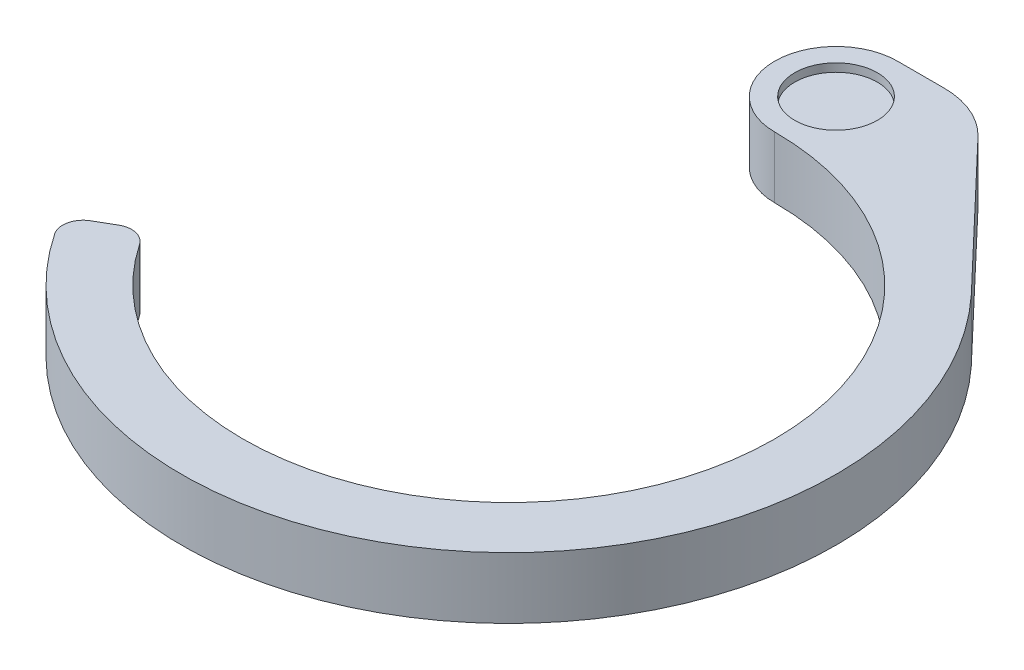
ISO-10303-21;
HEADER;
FILE_DESCRIPTION(('STEP AP214'),'2;1');
FILE_NAME('part.step','',(''),(''),'','','');
FILE_SCHEMA(('AUTOMOTIVE_DESIGN { 1 0 10303 214 1 1 1 1 }'));
ENDSEC;
DATA;
#1=APPLICATION_CONTEXT('core data for automotive mechanical design processes');
#2=APPLICATION_PROTOCOL_DEFINITION('international standard','automotive_design',2000,#1);
#3=PRODUCT_CONTEXT('',#1,'mechanical');
#4=PRODUCT('Part','Part','',(#3));
#5=PRODUCT_RELATED_PRODUCT_CATEGORY('part','',(#4));
#6=PRODUCT_DEFINITION_FORMATION('','',#4);
#7=PRODUCT_DEFINITION_CONTEXT('part definition',#1,'design');
#8=PRODUCT_DEFINITION('design','',#6,#7);
#9=PRODUCT_DEFINITION_SHAPE('','',#8);
#10=(LENGTH_UNIT() NAMED_UNIT(*) SI_UNIT(.MILLI.,.METRE.));
#11=(NAMED_UNIT(*) PLANE_ANGLE_UNIT() SI_UNIT($,.RADIAN.));
#12=(NAMED_UNIT(*) SI_UNIT($,.STERADIAN.) SOLID_ANGLE_UNIT());
#13=UNCERTAINTY_MEASURE_WITH_UNIT(LENGTH_MEASURE(1.E-05),#10,'distance_accuracy_value','');
#14=(GEOMETRIC_REPRESENTATION_CONTEXT(3) GLOBAL_UNCERTAINTY_ASSIGNED_CONTEXT((#13)) GLOBAL_UNIT_ASSIGNED_CONTEXT((#10,
#11,#12)) REPRESENTATION_CONTEXT('',''));
#15=CARTESIAN_POINT('',(0.,0.,0.));
#16=DIRECTION('',(0.,0.,1.));
#17=DIRECTION('',(1.,0.,0.));
#18=AXIS2_PLACEMENT_3D('',#15,#16,#17);
#19=CARTESIAN_POINT('',(-62.3074069840787,15.,41.7467008866615));
#20=DIRECTION('',(0.,-1.,0.));
#21=DIRECTION('',(0.,0.,-1.));
#22=AXIS2_PLACEMENT_3D('',#19,#20,#21);
#23=CYLINDRICAL_SURFACE('',#22,5.00000000000001);
#24=CARTESIAN_POINT('',(-62.3074069840787,0.,41.7467008866615));
#25=DIRECTION('',(0.,1.,0.));
#26=DIRECTION('',(0.,0.,1.));
#27=AXIS2_PLACEMENT_3D('',#24,#25,#26);
#28=CIRCLE('',#27,5.00000000000001);
#29=CARTESIAN_POINT('',(-66.4612341163506,0.,44.5298142791056));
#30=VERTEX_POINT('',#29);
#31=CARTESIAN_POINT('',(-64.8074069840787,0.,37.4165738677393));
#32=VERTEX_POINT('',#31);
#33=EDGE_CURVE('E134',#30,#32,#28,.F.);
#34=ORIENTED_EDGE('',*,*,#33,.F.);
#35=DIRECTION('',(0.,-1.,0.));
#36=VECTOR('',#35,1.);
#37=CARTESIAN_POINT('',(-66.4612341163506,15.,44.5298142791056));
#38=LINE('',#37,#36);
#39=CARTESIAN_POINT('',(-66.4612341163506,15.,44.5298142791056));
#40=VERTEX_POINT('',#39);
#41=EDGE_CURVE('E11',#40,#30,#38,.T.);
#42=ORIENTED_EDGE('',*,*,#41,.F.);
#43=CARTESIAN_POINT('',(-62.3074069840787,15.,41.7467008866615));
#44=DIRECTION('',(0.,1.,0.));
#45=DIRECTION('',(0.,0.,1.));
#46=AXIS2_PLACEMENT_3D('',#43,#44,#45);
#47=CIRCLE('',#46,5.00000000000001);
#48=CARTESIAN_POINT('',(-64.8074069840787,15.,37.4165738677393));
#49=VERTEX_POINT('',#48);
#50=EDGE_CURVE('E157',#40,#49,#47,.F.);
#51=ORIENTED_EDGE('',*,*,#50,.T.);
#52=DIRECTION('',(0.,-1.,0.));
#53=VECTOR('',#52,1.);
#54=CARTESIAN_POINT('',(-64.8074069840787,15.,37.4165738677393));
#55=LINE('',#54,#53);
#56=EDGE_CURVE('E86',#49,#32,#55,.T.);
#57=ORIENTED_EDGE('',*,*,#56,.T.);
#58=EDGE_LOOP('',(#34,#42,#51,#57));
#59=FACE_BOUND('',#58,.T.);
#60=ADVANCED_FACE('F33',(#59),#23,.T.);
#61=CARTESIAN_POINT('',(0.,15.,0.));
#62=DIRECTION('',(0.,-1.,0.));
#63=DIRECTION('',(0.,0.,-1.));
#64=AXIS2_PLACEMENT_3D('',#61,#62,#63);
#65=CYLINDRICAL_SURFACE('',#64,80.);
#66=CARTESIAN_POINT('',(0.,0.,0.));
#67=DIRECTION('',(0.,1.,0.));
#68=DIRECTION('',(0.,0.,1.));
#69=AXIS2_PLACEMENT_3D('',#66,#67,#68);
#70=CIRCLE('',#69,80.);
#71=CARTESIAN_POINT('',(58.5757297296054,0.,-54.4874654085159));
#72=VERTEX_POINT('',#71);
#73=EDGE_CURVE('E137',#30,#72,#70,.T.);
#74=ORIENTED_EDGE('',*,*,#73,.T.);
#75=DIRECTION('',(0.,-1.,0.));
#76=VECTOR('',#75,1.);
#77=CARTESIAN_POINT('',(58.5757297296054,15.,-54.4874654085159));
#78=LINE('',#77,#76);
#79=CARTESIAN_POINT('',(58.5757297296054,15.,-54.4874654085159));
#80=VERTEX_POINT('',#79);
#81=EDGE_CURVE('E41',#80,#72,#78,.T.);
#82=ORIENTED_EDGE('',*,*,#81,.F.);
#83=CARTESIAN_POINT('',(0.,15.,0.));
#84=DIRECTION('',(0.,1.,0.));
#85=DIRECTION('',(0.,0.,1.));
#86=AXIS2_PLACEMENT_3D('',#83,#84,#85);
#87=CIRCLE('',#86,80.);
#88=EDGE_CURVE('E187',#40,#80,#87,.T.);
#89=ORIENTED_EDGE('',*,*,#88,.F.);
#90=ORIENTED_EDGE('',*,*,#41,.T.);
#91=EDGE_LOOP('',(#74,#82,#89,#90));
#92=FACE_BOUND('',#91,.T.);
#93=ADVANCED_FACE('F175',(#92),#65,.T.);
#94=CARTESIAN_POINT('',(57.9325504327501,15.,-55.1629373618664));
#95=DIRECTION('',(0.724206102182212,0.,-0.689583585623996));
#96=DIRECTION('',(-0.689583585623996,0.,-0.724206102182212));
#97=AXIS2_PLACEMENT_3D('',#94,#95,#96);
#98=PLANE('',#97);
#99=DIRECTION('',(0.689583585623996,0.,0.724206102182212));
#100=VECTOR('',#99,1.);
#101=CARTESIAN_POINT('',(57.9325504327501,0.,-55.1629373618664));
#102=LINE('',#101,#100);
#103=CARTESIAN_POINT('',(25.911523347206,0.,-88.7916717124799));
#104=VERTEX_POINT('',#103);
#105=EDGE_CURVE('E141',#104,#72,#102,.T.);
#106=ORIENTED_EDGE('',*,*,#105,.F.);
#107=DIRECTION('',(0.,-1.,0.));
#108=VECTOR('',#107,1.);
#109=CARTESIAN_POINT('',(25.911523347206,15.,-88.7916717124799));
#110=LINE('',#109,#108);
#111=CARTESIAN_POINT('',(25.911523347206,15.,-88.7916717124799));
#112=VERTEX_POINT('',#111);
#113=EDGE_CURVE('E165',#112,#104,#110,.T.);
#114=ORIENTED_EDGE('',*,*,#113,.F.);
#115=DIRECTION('',(0.689583585623996,0.,0.724206102182212));
#116=VECTOR('',#115,1.);
#117=CARTESIAN_POINT('',(57.9325504327501,15.,-55.1629373618664));
#118=LINE('',#117,#116);
#119=EDGE_CURVE('E172',#112,#80,#118,.T.);
#120=ORIENTED_EDGE('',*,*,#119,.T.);
#121=ORIENTED_EDGE('',*,*,#81,.T.);
#122=EDGE_LOOP('',(#106,#114,#120,#121));
#123=FACE_BOUND('',#122,.T.);
#124=ADVANCED_FACE('F170',(#123),#98,.T.);
#125=CARTESIAN_POINT('',(11.4274013035615,15.,-75.));
#126=DIRECTION('',(0.,-1.,0.));
#127=DIRECTION('',(0.,0.,-1.));
#128=AXIS2_PLACEMENT_3D('',#125,#126,#127);
#129=CYLINDRICAL_SURFACE('',#128,20.0000000000001);
#130=CARTESIAN_POINT('',(11.4274013035615,0.,-75.));
#131=DIRECTION('',(0.,1.,0.));
#132=DIRECTION('',(0.,0.,1.));
#133=AXIS2_PLACEMENT_3D('',#130,#131,#132);
#134=CIRCLE('',#133,20.0000000000001);
#135=CARTESIAN_POINT('',(11.4274013035618,0.,-95.));
#136=VERTEX_POINT('',#135);
#137=EDGE_CURVE('E144',#136,#104,#134,.F.);
#138=ORIENTED_EDGE('',*,*,#137,.F.);
#139=DIRECTION('',(0.,-1.,0.));
#140=VECTOR('',#139,1.);
#141=CARTESIAN_POINT('',(11.4274013035618,15.,-95.));
#142=LINE('',#141,#140);
#143=CARTESIAN_POINT('',(11.4274013035618,15.,-95.));
#144=VERTEX_POINT('',#143);
#145=EDGE_CURVE('E163',#144,#136,#142,.T.);
#146=ORIENTED_EDGE('',*,*,#145,.F.);
#147=CARTESIAN_POINT('',(11.4274013035615,15.,-75.));
#148=DIRECTION('',(0.,1.,0.));
#149=DIRECTION('',(0.,0.,1.));
#150=AXIS2_PLACEMENT_3D('',#147,#148,#149);
#151=CIRCLE('',#150,20.0000000000001);
#152=EDGE_CURVE('E185',#144,#112,#151,.F.);
#153=ORIENTED_EDGE('',*,*,#152,.T.);
#154=ORIENTED_EDGE('',*,*,#113,.T.);
#155=EDGE_LOOP('',(#138,#146,#153,#154));
#156=FACE_BOUND('',#155,.T.);
#157=ADVANCED_FACE('F182',(#156),#129,.T.);
#158=CARTESIAN_POINT('',(-1.15370923512719E-13,15.,-95.));
#159=DIRECTION('',(0.,0.,-1.));
#160=DIRECTION('',(-1.,0.,0.));
#161=AXIS2_PLACEMENT_3D('',#158,#159,#160);
#162=PLANE('',#161);
#163=DIRECTION('',(1.,0.,0.));
#164=VECTOR('',#163,1.);
#165=CARTESIAN_POINT('',(-1.15370923512719E-13,0.,-95.));
#166=LINE('',#165,#164);
#167=CARTESIAN_POINT('',(0.,0.,-95.));
#168=VERTEX_POINT('',#167);
#169=EDGE_CURVE('E147',#168,#136,#166,.T.);
#170=ORIENTED_EDGE('',*,*,#169,.F.);
#171=DIRECTION('',(0.,-1.,0.));
#172=VECTOR('',#171,1.);
#173=CARTESIAN_POINT('',(0.,15.,-95.));
#174=LINE('',#173,#172);
#175=CARTESIAN_POINT('',(0.,15.,-95.));
#176=VERTEX_POINT('',#175);
#177=EDGE_CURVE('E161',#176,#168,#174,.T.);
#178=ORIENTED_EDGE('',*,*,#177,.F.);
#179=DIRECTION('',(1.,0.,0.));
#180=VECTOR('',#179,1.);
#181=CARTESIAN_POINT('',(-1.15370923512719E-13,15.,-95.));
#182=LINE('',#181,#180);
#183=EDGE_CURVE('E129',#176,#144,#182,.T.);
#184=ORIENTED_EDGE('',*,*,#183,.T.);
#185=ORIENTED_EDGE('',*,*,#145,.T.);
#186=EDGE_LOOP('',(#170,#178,#184,#185));
#187=FACE_BOUND('',#186,.T.);
#188=ADVANCED_FACE('F193',(#187),#162,.T.);
#189=CARTESIAN_POINT('',(0.,15.,-80.));
#190=DIRECTION('',(0.,-1.,0.));
#191=DIRECTION('',(0.,0.,-1.));
#192=AXIS2_PLACEMENT_3D('',#189,#190,#191);
#193=CYLINDRICAL_SURFACE('',#192,15.);
#194=CARTESIAN_POINT('',(0.,0.,-80.));
#195=DIRECTION('',(0.,1.,0.));
#196=DIRECTION('',(0.,0.,1.));
#197=AXIS2_PLACEMENT_3D('',#194,#195,#196);
#198=CIRCLE('',#197,15.);
#199=CARTESIAN_POINT('',(0.,0.,-65.));
#200=VERTEX_POINT('',#199);
#201=EDGE_CURVE('E150',#168,#200,#198,.T.);
#202=ORIENTED_EDGE('',*,*,#201,.T.);
#203=DIRECTION('',(0.,-1.,0.));
#204=VECTOR('',#203,1.);
#205=CARTESIAN_POINT('',(0.,15.,-65.));
#206=LINE('',#205,#204);
#207=CARTESIAN_POINT('',(0.,15.,-65.));
#208=VERTEX_POINT('',#207);
#209=EDGE_CURVE('E117',#208,#200,#206,.T.);
#210=ORIENTED_EDGE('',*,*,#209,.F.);
#211=CARTESIAN_POINT('',(0.,15.,-80.));
#212=DIRECTION('',(0.,1.,0.));
#213=DIRECTION('',(0.,0.,1.));
#214=AXIS2_PLACEMENT_3D('',#211,#212,#213);
#215=CIRCLE('',#214,15.);
#216=EDGE_CURVE('E126',#176,#208,#215,.T.);
#217=ORIENTED_EDGE('',*,*,#216,.F.);
#218=ORIENTED_EDGE('',*,*,#177,.T.);
#219=EDGE_LOOP('',(#202,#210,#217,#218));
#220=FACE_BOUND('',#219,.T.);
#221=ADVANCED_FACE('F195',(#220),#193,.T.);
#222=CARTESIAN_POINT('',(0.,15.,0.));
#223=DIRECTION('',(0.,-1.,0.));
#224=DIRECTION('',(0.,0.,-1.));
#225=AXIS2_PLACEMENT_3D('',#222,#223,#224);
#226=CYLINDRICAL_SURFACE('',#225,65.);
#227=CARTESIAN_POINT('',(0.,0.,0.));
#228=DIRECTION('',(0.,1.,0.));
#229=DIRECTION('',(0.,0.,1.));
#230=AXIS2_PLACEMENT_3D('',#227,#228,#229);
#231=CIRCLE('',#230,65.);
#232=CARTESIAN_POINT('',(-53.8264378899364,0.,36.4378180477484));
#233=VERTEX_POINT('',#232);
#234=EDGE_CURVE('E116',#233,#200,#231,.T.);
#235=ORIENTED_EDGE('',*,*,#234,.F.);
#236=DIRECTION('',(0.,-1.,0.));
#237=VECTOR('',#236,1.);
#238=CARTESIAN_POINT('',(-53.8264378899364,15.,36.4378180477484));
#239=LINE('',#238,#237);
#240=CARTESIAN_POINT('',(-53.8264378899364,15.,36.4378180477484));
#241=VERTEX_POINT('',#240);
#242=EDGE_CURVE('E110',#241,#233,#239,.T.);
#243=ORIENTED_EDGE('',*,*,#242,.F.);
#244=CARTESIAN_POINT('',(0.,15.,0.));
#245=DIRECTION('',(0.,1.,0.));
#246=DIRECTION('',(0.,0.,1.));
#247=AXIS2_PLACEMENT_3D('',#244,#245,#246);
#248=CIRCLE('',#247,65.);
#249=EDGE_CURVE('E114',#241,#208,#248,.T.);
#250=ORIENTED_EDGE('',*,*,#249,.T.);
#251=ORIENTED_EDGE('',*,*,#209,.T.);
#252=EDGE_LOOP('',(#235,#243,#250,#251));
#253=FACE_BOUND('',#252,.T.);
#254=ADVANCED_FACE('F112',(#253),#226,.F.);
#255=CARTESIAN_POINT('',(-57.9669331122392,15.,39.2407271283444));
#256=DIRECTION('',(0.,-1.,0.));
#257=DIRECTION('',(0.,0.,-1.));
#258=AXIS2_PLACEMENT_3D('',#255,#256,#257);
#259=CYLINDRICAL_SURFACE('',#258,5.);
#260=CARTESIAN_POINT('',(-57.9669331122392,0.,39.2407271283444));
#261=DIRECTION('',(0.,1.,0.));
#262=DIRECTION('',(0.,0.,1.));
#263=AXIS2_PLACEMENT_3D('',#260,#261,#262);
#264=CIRCLE('',#263,5.);
#265=CARTESIAN_POINT('',(-60.4669331122392,0.,34.9106001094222));
#266=VERTEX_POINT('',#265);
#267=EDGE_CURVE('E79',#233,#266,#264,.T.);
#268=ORIENTED_EDGE('',*,*,#267,.T.);
#269=DIRECTION('',(0.,-1.,0.));
#270=VECTOR('',#269,1.);
#271=CARTESIAN_POINT('',(-60.4669331122392,15.,34.9106001094222));
#272=LINE('',#271,#270);
#273=CARTESIAN_POINT('',(-60.4669331122392,15.,34.9106001094222));
#274=VERTEX_POINT('',#273);
#275=EDGE_CURVE('E118',#274,#266,#272,.T.);
#276=ORIENTED_EDGE('',*,*,#275,.F.);
#277=CARTESIAN_POINT('',(-57.9669331122392,15.,39.2407271283444));
#278=DIRECTION('',(0.,1.,0.));
#279=DIRECTION('',(0.,0.,1.));
#280=AXIS2_PLACEMENT_3D('',#277,#278,#279);
#281=CIRCLE('',#280,5.);
#282=EDGE_CURVE('E120',#241,#274,#281,.T.);
#283=ORIENTED_EDGE('',*,*,#282,.F.);
#284=ORIENTED_EDGE('',*,*,#242,.T.);
#285=EDGE_LOOP('',(#268,#276,#283,#284));
#286=FACE_BOUND('',#285,.T.);
#287=ADVANCED_FACE('F121',(#286),#259,.T.);
#288=CARTESIAN_POINT('',(0.,15.,0.));
#289=DIRECTION('',(0.499999999999997,0.,0.86602540378444));
#290=DIRECTION('',(0.86602540378444,0.,-0.499999999999997));
#291=AXIS2_PLACEMENT_3D('',#288,#289,#290);
#292=PLANE('',#291);
#293=DIRECTION('',(-0.86602540378444,0.,0.499999999999997));
#294=VECTOR('',#293,1.);
#295=CARTESIAN_POINT('',(0.,0.,0.));
#296=LINE('',#295,#294);
#297=EDGE_CURVE('E155',#266,#32,#296,.T.);
#298=ORIENTED_EDGE('',*,*,#297,.T.);
#299=ORIENTED_EDGE('',*,*,#56,.F.);
#300=DIRECTION('',(-0.86602540378444,0.,0.499999999999997));
#301=VECTOR('',#300,1.);
#302=CARTESIAN_POINT('',(0.,15.,0.));
#303=LINE('',#302,#301);
#304=EDGE_CURVE('E49',#274,#49,#303,.T.);
#305=ORIENTED_EDGE('',*,*,#304,.F.);
#306=ORIENTED_EDGE('',*,*,#275,.T.);
#307=EDGE_LOOP('',(#298,#299,#305,#306));
#308=FACE_BOUND('',#307,.T.);
#309=ADVANCED_FACE('F198',(#308),#292,.F.);
#310=CARTESIAN_POINT('',(0.,15.,0.));
#311=DIRECTION('',(0.,1.,0.));
#312=DIRECTION('',(0.,0.,1.));
#313=AXIS2_PLACEMENT_3D('',#310,#311,#312);
#314=PLANE('',#313);
#315=CARTESIAN_POINT('',(0.,15.,-80.));
#316=DIRECTION('',(0.,1.,0.));
#317=DIRECTION('',(0.,0.,1.));
#318=AXIS2_PLACEMENT_3D('',#315,#316,#317);
#319=CIRCLE('',#318,10.1);
#320=CARTESIAN_POINT('',(0.,15.,-69.9));
#321=VERTEX_POINT('',#320);
#322=EDGE_CURVE('E200',#321,#321,#319,.T.);
#323=ORIENTED_EDGE('',*,*,#322,.F.);
#324=EDGE_LOOP('',(#323));
#325=FACE_BOUND('',#324,.T.);
#326=ORIENTED_EDGE('',*,*,#50,.F.);
#327=ORIENTED_EDGE('',*,*,#88,.T.);
#328=ORIENTED_EDGE('',*,*,#119,.F.);
#329=ORIENTED_EDGE('',*,*,#152,.F.);
#330=ORIENTED_EDGE('',*,*,#183,.F.);
#331=ORIENTED_EDGE('',*,*,#216,.T.);
#332=ORIENTED_EDGE('',*,*,#249,.F.);
#333=ORIENTED_EDGE('',*,*,#282,.T.);
#334=ORIENTED_EDGE('',*,*,#304,.T.);
#335=EDGE_LOOP('',(#326,#327,#328,#329,#330,#331,#332,#333,#334));
#336=FACE_BOUND('',#335,.T.);
#337=ADVANCED_FACE('F123',(#325,#336),#314,.T.);
#338=CARTESIAN_POINT('',(0.,0.,0.));
#339=DIRECTION('',(0.,1.,0.));
#340=DIRECTION('',(0.,0.,1.));
#341=AXIS2_PLACEMENT_3D('',#338,#339,#340);
#342=PLANE('',#341);
#343=ORIENTED_EDGE('',*,*,#33,.T.);
#344=ORIENTED_EDGE('',*,*,#297,.F.);
#345=ORIENTED_EDGE('',*,*,#267,.F.);
#346=ORIENTED_EDGE('',*,*,#234,.T.);
#347=ORIENTED_EDGE('',*,*,#201,.F.);
#348=ORIENTED_EDGE('',*,*,#169,.T.);
#349=ORIENTED_EDGE('',*,*,#137,.T.);
#350=ORIENTED_EDGE('',*,*,#105,.T.);
#351=ORIENTED_EDGE('',*,*,#73,.F.);
#352=EDGE_LOOP('',(#343,#344,#345,#346,#347,#348,#349,#350,#351));
#353=FACE_BOUND('',#352,.T.);
#354=ADVANCED_FACE('F177',(#353),#342,.F.);
#355=CARTESIAN_POINT('',(0.,13.,-80.));
#356=DIRECTION('',(0.,1.,0.));
#357=DIRECTION('',(0.,0.,1.));
#358=AXIS2_PLACEMENT_3D('',#355,#356,#357);
#359=CYLINDRICAL_SURFACE('',#358,10.1);
#360=CARTESIAN_POINT('',(0.,13.,-80.));
#361=DIRECTION('',(0.,1.,0.));
#362=DIRECTION('',(0.,0.,1.));
#363=AXIS2_PLACEMENT_3D('',#360,#361,#362);
#364=CIRCLE('',#363,10.1);
#365=CARTESIAN_POINT('',(0.,13.,-69.9));
#366=VERTEX_POINT('',#365);
#367=EDGE_CURVE('E138',#366,#366,#364,.T.);
#368=ORIENTED_EDGE('',*,*,#367,.F.);
#369=EDGE_LOOP('',(#368));
#370=FACE_BOUND('',#369,.T.);
#371=ORIENTED_EDGE('',*,*,#322,.T.);
#372=EDGE_LOOP('',(#371));
#373=FACE_BOUND('',#372,.T.);
#374=ADVANCED_FACE('F208',(#370,#373),#359,.F.);
#375=CARTESIAN_POINT('',(0.,13.,-80.));
#376=DIRECTION('',(0.,1.,0.));
#377=DIRECTION('',(0.,0.,1.));
#378=AXIS2_PLACEMENT_3D('',#375,#376,#377);
#379=PLANE('',#378);
#380=ORIENTED_EDGE('',*,*,#367,.T.);
#381=EDGE_LOOP('',(#380));
#382=FACE_BOUND('',#381,.T.);
#383=ADVANCED_FACE('F206',(#382),#379,.T.);
#384=CLOSED_SHELL('',(#60,#93,#124,#157,#188,#221,#254,#287,#309,#337,#354,#374,#383));
#385=MANIFOLD_SOLID_BREP('B2',#384);
#386=ADVANCED_BREP_SHAPE_REPRESENTATION('',(#18,#385),#14);
#387=SHAPE_DEFINITION_REPRESENTATION(#9,#386);
ENDSEC;
END-ISO-10303-21;
